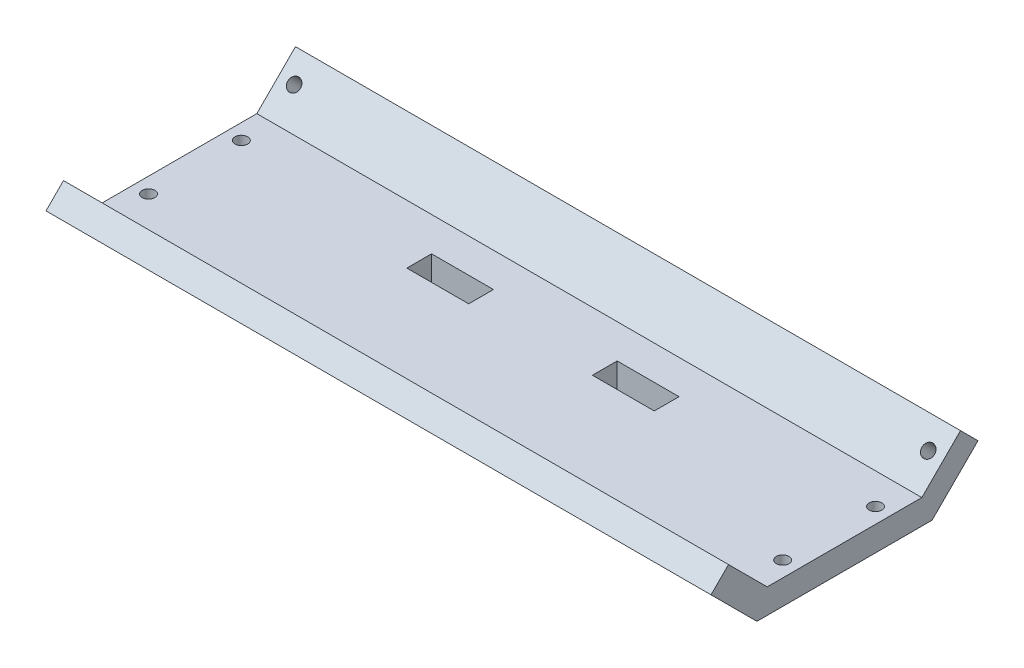
ISO-10303-21;
HEADER;
FILE_DESCRIPTION(('STEP AP214'),'2;1');
FILE_NAME('part.step','',(''),(''),'','','');
FILE_SCHEMA(('AUTOMOTIVE_DESIGN { 1 0 10303 214 1 1 1 1 }'));
ENDSEC;
DATA;
#1=APPLICATION_CONTEXT('core data for automotive mechanical design processes');
#2=APPLICATION_PROTOCOL_DEFINITION('international standard','automotive_design',2000,#1);
#3=PRODUCT_CONTEXT('',#1,'mechanical');
#4=PRODUCT('Part','Part','',(#3));
#5=PRODUCT_RELATED_PRODUCT_CATEGORY('part','',(#4));
#6=PRODUCT_DEFINITION_FORMATION('','',#4);
#7=PRODUCT_DEFINITION_CONTEXT('part definition',#1,'design');
#8=PRODUCT_DEFINITION('design','',#6,#7);
#9=PRODUCT_DEFINITION_SHAPE('','',#8);
#10=(LENGTH_UNIT() NAMED_UNIT(*) SI_UNIT(.MILLI.,.METRE.));
#11=(NAMED_UNIT(*) PLANE_ANGLE_UNIT() SI_UNIT($,.RADIAN.));
#12=(NAMED_UNIT(*) SI_UNIT($,.STERADIAN.) SOLID_ANGLE_UNIT());
#13=UNCERTAINTY_MEASURE_WITH_UNIT(LENGTH_MEASURE(1.E-05),#10,'distance_accuracy_value','');
#14=(GEOMETRIC_REPRESENTATION_CONTEXT(3) GLOBAL_UNCERTAINTY_ASSIGNED_CONTEXT((#13)) GLOBAL_UNIT_ASSIGNED_CONTEXT((#10,
#11,#12)) REPRESENTATION_CONTEXT('',''));
#15=CARTESIAN_POINT('',(0.,0.,0.));
#16=DIRECTION('',(0.,0.,1.));
#17=DIRECTION('',(1.,0.,0.));
#18=AXIS2_PLACEMENT_3D('',#15,#16,#17);
#19=CARTESIAN_POINT('',(107.5,12.4999999999999,37.5000000000001));
#20=DIRECTION('',(0.,-0.707106781186547,-0.707106781186548));
#21=DIRECTION('',(0.,0.707106781186548,-0.707106781186547));
#22=AXIS2_PLACEMENT_3D('',#19,#20,#21);
#23=PLANE('',#22);
#24=DIRECTION('',(0.,-0.707106781186548,0.707106781186547));
#25=VECTOR('',#24,1.);
#26=CARTESIAN_POINT('',(-107.5,12.4999999999999,37.5000000000001));
#27=LINE('',#26,#25);
#28=CARTESIAN_POINT('',(-107.5,12.4999999999999,37.5000000000001));
#29=VERTEX_POINT('',#28);
#30=CARTESIAN_POINT('',(-107.5,6.84314575050755,43.1568542494924));
#31=VERTEX_POINT('',#30);
#32=EDGE_CURVE('E268',#29,#31,#27,.T.);
#33=ORIENTED_EDGE('',*,*,#32,.T.);
#34=DIRECTION('',(-1.,0.,0.));
#35=VECTOR('',#34,1.);
#36=CARTESIAN_POINT('',(107.5,6.84314575050755,43.1568542494924));
#37=LINE('',#36,#35);
#38=CARTESIAN_POINT('',(107.5,6.84314575050755,43.1568542494924));
#39=VERTEX_POINT('',#38);
#40=EDGE_CURVE('E11',#39,#31,#37,.T.);
#41=ORIENTED_EDGE('',*,*,#40,.F.);
#42=DIRECTION('',(0.,-0.707106781186548,0.707106781186547));
#43=VECTOR('',#42,1.);
#44=CARTESIAN_POINT('',(107.5,12.4999999999999,37.5000000000001));
#45=LINE('',#44,#43);
#46=CARTESIAN_POINT('',(107.5,12.4999999999999,37.5000000000001));
#47=VERTEX_POINT('',#46);
#48=EDGE_CURVE('E269',#47,#39,#45,.T.);
#49=ORIENTED_EDGE('',*,*,#48,.F.);
#50=DIRECTION('',(-1.,0.,0.));
#51=VECTOR('',#50,1.);
#52=CARTESIAN_POINT('',(107.5,12.4999999999999,37.5000000000001));
#53=LINE('',#52,#51);
#54=EDGE_CURVE('E287',#47,#29,#53,.T.);
#55=ORIENTED_EDGE('',*,*,#54,.T.);
#56=EDGE_LOOP('',(#33,#41,#49,#55));
#57=FACE_BOUND('',#56,.T.);
#58=ADVANCED_FACE('F38',(#57),#23,.F.);
#59=CARTESIAN_POINT('',(107.5,-8.,28.313708498985));
#60=DIRECTION('',(0.,0.707106781186544,-0.707106781186551));
#61=DIRECTION('',(0.,0.707106781186551,0.707106781186544));
#62=AXIS2_PLACEMENT_3D('',#59,#60,#61);
#63=PLANE('',#62);
#64=CARTESIAN_POINT('',(-102.5,1.414213562373,37.7279220613579));
#65=DIRECTION('',(0.,0.707106781186544,-0.707106781186551));
#66=DIRECTION('',(0.,0.707106781186551,0.707106781186544));
#67=AXIS2_PLACEMENT_3D('',#64,#65,#66);
#68=CIRCLE('',#67,2.04999999999999);
#69=CARTESIAN_POINT('',(-102.5,2.86378246380542,39.1774909627903));
#70=VERTEX_POINT('',#69);
#71=EDGE_CURVE('E241',#70,#70,#68,.T.);
#72=ORIENTED_EDGE('',*,*,#71,.T.);
#73=EDGE_LOOP('',(#72));
#74=FACE_BOUND('',#73,.T.);
#75=CARTESIAN_POINT('',(102.5,1.414213562373,37.7279220613579));
#76=DIRECTION('',(0.,0.707106781186544,-0.707106781186551));
#77=DIRECTION('',(0.,0.707106781186551,0.707106781186544));
#78=AXIS2_PLACEMENT_3D('',#75,#76,#77);
#79=CIRCLE('',#78,2.04999999999999);
#80=CARTESIAN_POINT('',(102.5,2.86378246380542,39.1774909627903));
#81=VERTEX_POINT('',#80);
#82=EDGE_CURVE('E247',#81,#81,#79,.T.);
#83=ORIENTED_EDGE('',*,*,#82,.T.);
#84=EDGE_LOOP('',(#83));
#85=FACE_BOUND('',#84,.T.);
#86=DIRECTION('',(0.,-0.707106781186551,-0.707106781186544));
#87=VECTOR('',#86,1.);
#88=CARTESIAN_POINT('',(-107.5,-8.,28.313708498985));
#89=LINE('',#88,#87);
#90=CARTESIAN_POINT('',(-107.5,-8.,28.313708498985));
#91=VERTEX_POINT('',#90);
#92=EDGE_CURVE('E290',#31,#91,#89,.T.);
#93=ORIENTED_EDGE('',*,*,#92,.T.);
#94=DIRECTION('',(-1.,0.,0.));
#95=VECTOR('',#94,1.);
#96=CARTESIAN_POINT('',(107.5,-8.,28.313708498985));
#97=LINE('',#96,#95);
#98=CARTESIAN_POINT('',(107.5,-8.,28.313708498985));
#99=VERTEX_POINT('',#98);
#100=EDGE_CURVE('E45',#99,#91,#97,.T.);
#101=ORIENTED_EDGE('',*,*,#100,.F.);
#102=DIRECTION('',(0.,-0.707106781186551,-0.707106781186544));
#103=VECTOR('',#102,1.);
#104=CARTESIAN_POINT('',(107.5,-8.,28.313708498985));
#105=LINE('',#104,#103);
#106=EDGE_CURVE('E272',#39,#99,#105,.T.);
#107=ORIENTED_EDGE('',*,*,#106,.F.);
#108=ORIENTED_EDGE('',*,*,#40,.T.);
#109=EDGE_LOOP('',(#93,#101,#107,#108));
#110=FACE_BOUND('',#109,.T.);
#111=ADVANCED_FACE('F346',(#74,#85,#110),#63,.F.);
#112=CARTESIAN_POINT('',(107.5,-8.,28.313708498985));
#113=DIRECTION('',(0.,1.,0.));
#114=DIRECTION('',(0.,0.,1.));
#115=AXIS2_PLACEMENT_3D('',#112,#113,#114);
#116=PLANE('',#115);
#117=DIRECTION('',(1.,0.,0.));
#118=VECTOR('',#117,1.);
#119=CARTESIAN_POINT('',(20.,-8.,-6.));
#120=LINE('',#119,#118);
#121=CARTESIAN_POINT('',(20.,-8.,-6.));
#122=VERTEX_POINT('',#121);
#123=CARTESIAN_POINT('',(40.,-8.,-6.));
#124=VERTEX_POINT('',#123);
#125=EDGE_CURVE('E162',#122,#124,#120,.T.);
#126=ORIENTED_EDGE('',*,*,#125,.T.);
#127=DIRECTION('',(0.,0.,-1.));
#128=VECTOR('',#127,1.);
#129=CARTESIAN_POINT('',(40.,-8.,-14.));
#130=LINE('',#129,#128);
#131=CARTESIAN_POINT('',(40.,-8.,-14.));
#132=VERTEX_POINT('',#131);
#133=EDGE_CURVE('E154',#124,#132,#130,.T.);
#134=ORIENTED_EDGE('',*,*,#133,.T.);
#135=DIRECTION('',(-1.,0.,0.));
#136=VECTOR('',#135,1.);
#137=CARTESIAN_POINT('',(20.,-8.,-14.));
#138=LINE('',#137,#136);
#139=CARTESIAN_POINT('',(20.,-8.,-14.));
#140=VERTEX_POINT('',#139);
#141=EDGE_CURVE('E165',#132,#140,#138,.T.);
#142=ORIENTED_EDGE('',*,*,#141,.T.);
#143=DIRECTION('',(0.,0.,1.));
#144=VECTOR('',#143,1.);
#145=CARTESIAN_POINT('',(20.,-8.,-14.));
#146=LINE('',#145,#144);
#147=EDGE_CURVE('E52',#140,#122,#146,.T.);
#148=ORIENTED_EDGE('',*,*,#147,.T.);
#149=EDGE_LOOP('',(#126,#134,#142,#148));
#150=FACE_BOUND('',#149,.T.);
#151=DIRECTION('',(1.,0.,0.));
#152=VECTOR('',#151,1.);
#153=CARTESIAN_POINT('',(-40.,-8.,-6.));
#154=LINE('',#153,#152);
#155=CARTESIAN_POINT('',(-40.,-8.,-6.));
#156=VERTEX_POINT('',#155);
#157=CARTESIAN_POINT('',(-20.,-8.,-6.));
#158=VERTEX_POINT('',#157);
#159=EDGE_CURVE('E195',#156,#158,#154,.T.);
#160=ORIENTED_EDGE('',*,*,#159,.T.);
#161=DIRECTION('',(0.,0.,-1.));
#162=VECTOR('',#161,1.);
#163=CARTESIAN_POINT('',(-20.,-8.,-14.));
#164=LINE('',#163,#162);
#165=CARTESIAN_POINT('',(-20.,-8.,-14.));
#166=VERTEX_POINT('',#165);
#167=EDGE_CURVE('E206',#158,#166,#164,.T.);
#168=ORIENTED_EDGE('',*,*,#167,.T.);
#169=DIRECTION('',(-1.,0.,0.));
#170=VECTOR('',#169,1.);
#171=CARTESIAN_POINT('',(-40.,-8.,-14.));
#172=LINE('',#171,#170);
#173=CARTESIAN_POINT('',(-40.,-8.,-14.));
#174=VERTEX_POINT('',#173);
#175=EDGE_CURVE('E216',#166,#174,#172,.T.);
#176=ORIENTED_EDGE('',*,*,#175,.T.);
#177=DIRECTION('',(0.,0.,1.));
#178=VECTOR('',#177,1.);
#179=CARTESIAN_POINT('',(-40.,-8.,-14.));
#180=LINE('',#179,#178);
#181=EDGE_CURVE('E60',#174,#156,#180,.T.);
#182=ORIENTED_EDGE('',*,*,#181,.T.);
#183=EDGE_LOOP('',(#160,#168,#176,#182));
#184=FACE_BOUND('',#183,.T.);
#185=CARTESIAN_POINT('',(-102.5,-8.,-15.0000000000001));
#186=DIRECTION('',(0.,1.,0.));
#187=DIRECTION('',(0.,0.,1.));
#188=AXIS2_PLACEMENT_3D('',#185,#186,#187);
#189=CIRCLE('',#188,2.05);
#190=CARTESIAN_POINT('',(-102.5,-8.,-12.9500000000001));
#191=VERTEX_POINT('',#190);
#192=EDGE_CURVE('E229',#191,#191,#189,.T.);
#193=ORIENTED_EDGE('',*,*,#192,.T.);
#194=EDGE_LOOP('',(#193));
#195=FACE_BOUND('',#194,.T.);
#196=CARTESIAN_POINT('',(-102.5,-8.,15.0000000000001));
#197=DIRECTION('',(0.,1.,0.));
#198=DIRECTION('',(0.,0.,1.));
#199=AXIS2_PLACEMENT_3D('',#196,#197,#198);
#200=CIRCLE('',#199,2.05);
#201=CARTESIAN_POINT('',(-102.5,-8.,17.0500000000001));
#202=VERTEX_POINT('',#201);
#203=EDGE_CURVE('E235',#202,#202,#200,.T.);
#204=ORIENTED_EDGE('',*,*,#203,.T.);
#205=EDGE_LOOP('',(#204));
#206=FACE_BOUND('',#205,.T.);
#207=CARTESIAN_POINT('',(102.5,-8.,15.0000000000001));
#208=DIRECTION('',(0.,1.,0.));
#209=DIRECTION('',(0.,0.,1.));
#210=AXIS2_PLACEMENT_3D('',#207,#208,#209);
#211=CIRCLE('',#210,2.05);
#212=CARTESIAN_POINT('',(102.5,-8.,17.0500000000001));
#213=VERTEX_POINT('',#212);
#214=EDGE_CURVE('E253',#213,#213,#211,.T.);
#215=ORIENTED_EDGE('',*,*,#214,.T.);
#216=EDGE_LOOP('',(#215));
#217=FACE_BOUND('',#216,.T.);
#218=CARTESIAN_POINT('',(102.5,-8.,-15.0000000000001));
#219=DIRECTION('',(0.,1.,0.));
#220=DIRECTION('',(0.,0.,1.));
#221=AXIS2_PLACEMENT_3D('',#218,#219,#220);
#222=CIRCLE('',#221,2.05);
#223=CARTESIAN_POINT('',(102.5,-8.,-12.9500000000001));
#224=VERTEX_POINT('',#223);
#225=EDGE_CURVE('E259',#224,#224,#222,.T.);
#226=ORIENTED_EDGE('',*,*,#225,.T.);
#227=EDGE_LOOP('',(#226));
#228=FACE_BOUND('',#227,.T.);
#229=DIRECTION('',(0.,0.,-1.));
#230=VECTOR('',#229,1.);
#231=CARTESIAN_POINT('',(-107.5,-8.,28.313708498985));
#232=LINE('',#231,#230);
#233=CARTESIAN_POINT('',(-107.5,-8.,-28.3137084989848));
#234=VERTEX_POINT('',#233);
#235=EDGE_CURVE('E292',#91,#234,#232,.T.);
#236=ORIENTED_EDGE('',*,*,#235,.T.);
#237=DIRECTION('',(-1.,0.,0.));
#238=VECTOR('',#237,1.);
#239=CARTESIAN_POINT('',(107.5,-8.,-28.3137084989848));
#240=LINE('',#239,#238);
#241=CARTESIAN_POINT('',(107.5,-8.,-28.3137084989848));
#242=VERTEX_POINT('',#241);
#243=EDGE_CURVE('E317',#242,#234,#240,.T.);
#244=ORIENTED_EDGE('',*,*,#243,.F.);
#245=DIRECTION('',(0.,0.,-1.));
#246=VECTOR('',#245,1.);
#247=CARTESIAN_POINT('',(107.5,-8.,28.313708498985));
#248=LINE('',#247,#246);
#249=EDGE_CURVE('E275',#99,#242,#248,.T.);
#250=ORIENTED_EDGE('',*,*,#249,.F.);
#251=ORIENTED_EDGE('',*,*,#100,.T.);
#252=EDGE_LOOP('',(#236,#244,#250,#251));
#253=FACE_BOUND('',#252,.T.);
#254=ADVANCED_FACE('F169',(#150,#184,#195,#206,#217,#228,#253),#116,.F.);
#255=CARTESIAN_POINT('',(107.5,-8.,-28.3137084989848));
#256=DIRECTION('',(0.,0.707106781186547,0.707106781186547));
#257=DIRECTION('',(0.,-0.707106781186548,0.707106781186548));
#258=AXIS2_PLACEMENT_3D('',#255,#256,#257);
#259=PLANE('',#258);
#260=CARTESIAN_POINT('',(-102.5,1.41421356237308,-37.7279220613579));
#261=DIRECTION('',(0.,0.707106781186547,0.707106781186547));
#262=DIRECTION('',(0.,-0.707106781186548,0.707106781186548));
#263=AXIS2_PLACEMENT_3D('',#260,#261,#262);
#264=CIRCLE('',#263,2.04999999999999);
#265=CARTESIAN_POINT('',(-102.5,-0.0353553390593389,-36.2783531599255));
#266=VERTEX_POINT('',#265);
#267=EDGE_CURVE('E223',#266,#266,#264,.T.);
#268=ORIENTED_EDGE('',*,*,#267,.T.);
#269=EDGE_LOOP('',(#268));
#270=FACE_BOUND('',#269,.T.);
#271=CARTESIAN_POINT('',(102.5,1.41421356237306,-37.7279220613579));
#272=DIRECTION('',(0.,0.707106781186547,0.707106781186547));
#273=DIRECTION('',(0.,-0.707106781186548,0.707106781186548));
#274=AXIS2_PLACEMENT_3D('',#271,#272,#273);
#275=CIRCLE('',#274,2.04999999999999);
#276=CARTESIAN_POINT('',(102.5,-0.0353553390593537,-36.2783531599255));
#277=VERTEX_POINT('',#276);
#278=EDGE_CURVE('E265',#277,#277,#275,.T.);
#279=ORIENTED_EDGE('',*,*,#278,.T.);
#280=EDGE_LOOP('',(#279));
#281=FACE_BOUND('',#280,.T.);
#282=DIRECTION('',(0.,0.707106781186548,-0.707106781186548));
#283=VECTOR('',#282,1.);
#284=CARTESIAN_POINT('',(-107.5,-8.,-28.3137084989848));
#285=LINE('',#284,#283);
#286=CARTESIAN_POINT('',(-107.5,6.84314575050755,-43.1568542494924));
#287=VERTEX_POINT('',#286);
#288=EDGE_CURVE('E294',#234,#287,#285,.T.);
#289=ORIENTED_EDGE('',*,*,#288,.T.);
#290=DIRECTION('',(-1.,0.,0.));
#291=VECTOR('',#290,1.);
#292=CARTESIAN_POINT('',(107.5,6.84314575050755,-43.1568542494924));
#293=LINE('',#292,#291);
#294=CARTESIAN_POINT('',(107.5,6.84314575050755,-43.1568542494924));
#295=VERTEX_POINT('',#294);
#296=EDGE_CURVE('E314',#295,#287,#293,.T.);
#297=ORIENTED_EDGE('',*,*,#296,.F.);
#298=DIRECTION('',(0.,0.707106781186548,-0.707106781186548));
#299=VECTOR('',#298,1.);
#300=CARTESIAN_POINT('',(107.5,-8.,-28.3137084989848));
#301=LINE('',#300,#299);
#302=EDGE_CURVE('E277',#242,#295,#301,.T.);
#303=ORIENTED_EDGE('',*,*,#302,.F.);
#304=ORIENTED_EDGE('',*,*,#243,.T.);
#305=EDGE_LOOP('',(#289,#297,#303,#304));
#306=FACE_BOUND('',#305,.T.);
#307=ADVANCED_FACE('F334',(#270,#281,#306),#259,.F.);
#308=CARTESIAN_POINT('',(107.5,12.5,-37.5));
#309=DIRECTION('',(0.,-0.707106781186547,0.707106781186548));
#310=DIRECTION('',(0.,-0.707106781186548,-0.707106781186547));
#311=AXIS2_PLACEMENT_3D('',#308,#309,#310);
#312=PLANE('',#311);
#313=DIRECTION('',(0.,0.707106781186548,0.707106781186547));
#314=VECTOR('',#313,1.);
#315=CARTESIAN_POINT('',(-107.5,12.5,-37.5));
#316=LINE('',#315,#314);
#317=CARTESIAN_POINT('',(-107.5,12.5,-37.5));
#318=VERTEX_POINT('',#317);
#319=EDGE_CURVE('E296',#287,#318,#316,.T.);
#320=ORIENTED_EDGE('',*,*,#319,.T.);
#321=DIRECTION('',(-1.,0.,0.));
#322=VECTOR('',#321,1.);
#323=CARTESIAN_POINT('',(107.5,12.5,-37.5));
#324=LINE('',#323,#322);
#325=CARTESIAN_POINT('',(107.5,12.5,-37.5));
#326=VERTEX_POINT('',#325);
#327=EDGE_CURVE('E311',#326,#318,#324,.T.);
#328=ORIENTED_EDGE('',*,*,#327,.F.);
#329=DIRECTION('',(0.,0.707106781186548,0.707106781186547));
#330=VECTOR('',#329,1.);
#331=CARTESIAN_POINT('',(107.5,12.5,-37.5));
#332=LINE('',#331,#330);
#333=EDGE_CURVE('E279',#295,#326,#332,.T.);
#334=ORIENTED_EDGE('',*,*,#333,.F.);
#335=ORIENTED_EDGE('',*,*,#296,.T.);
#336=EDGE_LOOP('',(#320,#328,#334,#335));
#337=FACE_BOUND('',#336,.T.);
#338=ADVANCED_FACE('F338',(#337),#312,.F.);
#339=CARTESIAN_POINT('',(107.5,0.,-25.0000000000001));
#340=DIRECTION('',(0.,-0.707106781186546,-0.707106781186549));
#341=DIRECTION('',(0.,0.707106781186549,-0.707106781186546));
#342=AXIS2_PLACEMENT_3D('',#339,#340,#341);
#343=PLANE('',#342);
#344=CARTESIAN_POINT('',(-102.5,7.07106781186545,-32.0710678118655));
#345=DIRECTION('',(0.,0.707106781186546,0.707106781186549));
#346=DIRECTION('',(0.,-0.707106781186549,0.707106781186546));
#347=AXIS2_PLACEMENT_3D('',#344,#345,#346);
#348=CIRCLE('',#347,2.04999999999998);
#349=CARTESIAN_POINT('',(-102.5,5.62149891043304,-30.6214989104331));
#350=VERTEX_POINT('',#349);
#351=EDGE_CURVE('E188',#350,#350,#348,.T.);
#352=ORIENTED_EDGE('',*,*,#351,.F.);
#353=EDGE_LOOP('',(#352));
#354=FACE_BOUND('',#353,.T.);
#355=CARTESIAN_POINT('',(102.5,7.07106781186544,-32.0710678118655));
#356=DIRECTION('',(0.,0.707106781186546,0.707106781186549));
#357=DIRECTION('',(0.,-0.707106781186549,0.707106781186546));
#358=AXIS2_PLACEMENT_3D('',#355,#356,#357);
#359=CIRCLE('',#358,2.04999999999998);
#360=CARTESIAN_POINT('',(102.5,5.62149891043302,-30.6214989104331));
#361=VERTEX_POINT('',#360);
#362=EDGE_CURVE('E262',#361,#361,#359,.T.);
#363=ORIENTED_EDGE('',*,*,#362,.F.);
#364=EDGE_LOOP('',(#363));
#365=FACE_BOUND('',#364,.T.);
#366=DIRECTION('',(0.,-0.707106781186549,0.707106781186546));
#367=VECTOR('',#366,1.);
#368=CARTESIAN_POINT('',(-107.5,0.,-25.0000000000001));
#369=LINE('',#368,#367);
#370=CARTESIAN_POINT('',(-107.5,0.,-25.0000000000001));
#371=VERTEX_POINT('',#370);
#372=EDGE_CURVE('E298',#318,#371,#369,.T.);
#373=ORIENTED_EDGE('',*,*,#372,.T.);
#374=DIRECTION('',(-1.,0.,0.));
#375=VECTOR('',#374,1.);
#376=CARTESIAN_POINT('',(107.5,0.,-25.0000000000001));
#377=LINE('',#376,#375);
#378=CARTESIAN_POINT('',(107.5,0.,-25.0000000000001));
#379=VERTEX_POINT('',#378);
#380=EDGE_CURVE('E308',#379,#371,#377,.T.);
#381=ORIENTED_EDGE('',*,*,#380,.F.);
#382=DIRECTION('',(0.,-0.707106781186549,0.707106781186546));
#383=VECTOR('',#382,1.);
#384=CARTESIAN_POINT('',(107.5,0.,-25.0000000000001));
#385=LINE('',#384,#383);
#386=EDGE_CURVE('E281',#326,#379,#385,.T.);
#387=ORIENTED_EDGE('',*,*,#386,.F.);
#388=ORIENTED_EDGE('',*,*,#327,.T.);
#389=EDGE_LOOP('',(#373,#381,#387,#388));
#390=FACE_BOUND('',#389,.T.);
#391=ADVANCED_FACE('F359',(#354,#365,#390),#343,.F.);
#392=CARTESIAN_POINT('',(107.5,0.,25.0000000000001));
#393=DIRECTION('',(0.,-1.,0.));
#394=DIRECTION('',(0.,0.,-1.));
#395=AXIS2_PLACEMENT_3D('',#392,#393,#394);
#396=PLANE('',#395);
#397=DIRECTION('',(-1.,0.,0.));
#398=VECTOR('',#397,1.);
#399=CARTESIAN_POINT('',(20.,0.,-14.));
#400=LINE('',#399,#398);
#401=CARTESIAN_POINT('',(40.,0.,-14.));
#402=VERTEX_POINT('',#401);
#403=CARTESIAN_POINT('',(20.,0.,-14.));
#404=VERTEX_POINT('',#403);
#405=EDGE_CURVE('E181',#402,#404,#400,.T.);
#406=ORIENTED_EDGE('',*,*,#405,.F.);
#407=DIRECTION('',(0.,0.,-1.));
#408=VECTOR('',#407,1.);
#409=CARTESIAN_POINT('',(40.,0.,-14.));
#410=LINE('',#409,#408);
#411=CARTESIAN_POINT('',(40.,0.,-6.));
#412=VERTEX_POINT('',#411);
#413=EDGE_CURVE('E157',#412,#402,#410,.T.);
#414=ORIENTED_EDGE('',*,*,#413,.F.);
#415=DIRECTION('',(1.,0.,0.));
#416=VECTOR('',#415,1.);
#417=CARTESIAN_POINT('',(20.,0.,-6.));
#418=LINE('',#417,#416);
#419=CARTESIAN_POINT('',(20.,0.,-6.));
#420=VERTEX_POINT('',#419);
#421=EDGE_CURVE('E172',#420,#412,#418,.T.);
#422=ORIENTED_EDGE('',*,*,#421,.F.);
#423=DIRECTION('',(0.,0.,1.));
#424=VECTOR('',#423,1.);
#425=CARTESIAN_POINT('',(20.,0.,-14.));
#426=LINE('',#425,#424);
#427=EDGE_CURVE('E175',#404,#420,#426,.T.);
#428=ORIENTED_EDGE('',*,*,#427,.F.);
#429=EDGE_LOOP('',(#406,#414,#422,#428));
#430=FACE_BOUND('',#429,.T.);
#431=DIRECTION('',(-1.,0.,0.));
#432=VECTOR('',#431,1.);
#433=CARTESIAN_POINT('',(-40.,0.,-14.));
#434=LINE('',#433,#432);
#435=CARTESIAN_POINT('',(-20.,0.,-14.));
#436=VERTEX_POINT('',#435);
#437=CARTESIAN_POINT('',(-40.,0.,-14.));
#438=VERTEX_POINT('',#437);
#439=EDGE_CURVE('E209',#436,#438,#434,.T.);
#440=ORIENTED_EDGE('',*,*,#439,.F.);
#441=DIRECTION('',(0.,0.,-1.));
#442=VECTOR('',#441,1.);
#443=CARTESIAN_POINT('',(-20.,0.,-14.));
#444=LINE('',#443,#442);
#445=CARTESIAN_POINT('',(-20.,0.,-6.));
#446=VERTEX_POINT('',#445);
#447=EDGE_CURVE('E182',#446,#436,#444,.T.);
#448=ORIENTED_EDGE('',*,*,#447,.F.);
#449=DIRECTION('',(1.,0.,0.));
#450=VECTOR('',#449,1.);
#451=CARTESIAN_POINT('',(-40.,0.,-6.));
#452=LINE('',#451,#450);
#453=CARTESIAN_POINT('',(-40.,0.,-6.));
#454=VERTEX_POINT('',#453);
#455=EDGE_CURVE('E202',#454,#446,#452,.T.);
#456=ORIENTED_EDGE('',*,*,#455,.F.);
#457=DIRECTION('',(0.,0.,1.));
#458=VECTOR('',#457,1.);
#459=CARTESIAN_POINT('',(-40.,0.,-14.));
#460=LINE('',#459,#458);
#461=EDGE_CURVE('E205',#438,#454,#460,.T.);
#462=ORIENTED_EDGE('',*,*,#461,.F.);
#463=EDGE_LOOP('',(#440,#448,#456,#462));
#464=FACE_BOUND('',#463,.T.);
#465=CARTESIAN_POINT('',(-102.5,0.,-15.0000000000001));
#466=DIRECTION('',(0.,1.,0.));
#467=DIRECTION('',(0.,0.,1.));
#468=AXIS2_PLACEMENT_3D('',#465,#466,#467);
#469=CIRCLE('',#468,2.04999999999998);
#470=CARTESIAN_POINT('',(-102.5,0.,-12.9500000000001));
#471=VERTEX_POINT('',#470);
#472=EDGE_CURVE('E226',#471,#471,#469,.T.);
#473=ORIENTED_EDGE('',*,*,#472,.F.);
#474=EDGE_LOOP('',(#473));
#475=FACE_BOUND('',#474,.T.);
#476=CARTESIAN_POINT('',(-102.5,0.,15.0000000000001));
#477=DIRECTION('',(0.,1.,0.));
#478=DIRECTION('',(0.,0.,1.));
#479=AXIS2_PLACEMENT_3D('',#476,#477,#478);
#480=CIRCLE('',#479,2.04999999999998);
#481=CARTESIAN_POINT('',(-102.5,0.,17.0500000000001));
#482=VERTEX_POINT('',#481);
#483=EDGE_CURVE('E232',#482,#482,#480,.T.);
#484=ORIENTED_EDGE('',*,*,#483,.F.);
#485=EDGE_LOOP('',(#484));
#486=FACE_BOUND('',#485,.T.);
#487=CARTESIAN_POINT('',(102.5,0.,15.0000000000001));
#488=DIRECTION('',(0.,1.,0.));
#489=DIRECTION('',(0.,0.,1.));
#490=AXIS2_PLACEMENT_3D('',#487,#488,#489);
#491=CIRCLE('',#490,2.04999999999998);
#492=CARTESIAN_POINT('',(102.5,0.,17.0500000000001));
#493=VERTEX_POINT('',#492);
#494=EDGE_CURVE('E250',#493,#493,#491,.T.);
#495=ORIENTED_EDGE('',*,*,#494,.F.);
#496=EDGE_LOOP('',(#495));
#497=FACE_BOUND('',#496,.T.);
#498=CARTESIAN_POINT('',(102.5,0.,-15.0000000000001));
#499=DIRECTION('',(0.,1.,0.));
#500=DIRECTION('',(0.,0.,1.));
#501=AXIS2_PLACEMENT_3D('',#498,#499,#500);
#502=CIRCLE('',#501,2.04999999999998);
#503=CARTESIAN_POINT('',(102.5,0.,-12.9500000000001));
#504=VERTEX_POINT('',#503);
#505=EDGE_CURVE('E256',#504,#504,#502,.T.);
#506=ORIENTED_EDGE('',*,*,#505,.F.);
#507=EDGE_LOOP('',(#506));
#508=FACE_BOUND('',#507,.T.);
#509=DIRECTION('',(0.,0.,1.));
#510=VECTOR('',#509,1.);
#511=CARTESIAN_POINT('',(-107.5,0.,25.0000000000001));
#512=LINE('',#511,#510);
#513=CARTESIAN_POINT('',(-107.5,0.,25.0000000000001));
#514=VERTEX_POINT('',#513);
#515=EDGE_CURVE('E300',#371,#514,#512,.T.);
#516=ORIENTED_EDGE('',*,*,#515,.T.);
#517=DIRECTION('',(-1.,0.,0.));
#518=VECTOR('',#517,1.);
#519=CARTESIAN_POINT('',(107.5,0.,25.0000000000001));
#520=LINE('',#519,#518);
#521=CARTESIAN_POINT('',(107.5,0.,25.0000000000001));
#522=VERTEX_POINT('',#521);
#523=EDGE_CURVE('E305',#522,#514,#520,.T.);
#524=ORIENTED_EDGE('',*,*,#523,.F.);
#525=DIRECTION('',(0.,0.,1.));
#526=VECTOR('',#525,1.);
#527=CARTESIAN_POINT('',(107.5,0.,25.0000000000001));
#528=LINE('',#527,#526);
#529=EDGE_CURVE('E283',#379,#522,#528,.T.);
#530=ORIENTED_EDGE('',*,*,#529,.F.);
#531=ORIENTED_EDGE('',*,*,#380,.T.);
#532=EDGE_LOOP('',(#516,#524,#530,#531));
#533=FACE_BOUND('',#532,.T.);
#534=ADVANCED_FACE('F357',(#430,#464,#475,#486,#497,#508,#533),#396,.F.);
#535=CARTESIAN_POINT('',(107.5,0.,25.0000000000001));
#536=DIRECTION('',(0.,-0.707106781186551,0.707106781186544));
#537=DIRECTION('',(0.,-0.707106781186544,-0.707106781186551));
#538=AXIS2_PLACEMENT_3D('',#535,#536,#537);
#539=PLANE('',#538);
#540=CARTESIAN_POINT('',(-102.5,7.0710678118654,32.0710678118656));
#541=DIRECTION('',(0.,0.707106781186551,-0.707106781186544));
#542=DIRECTION('',(0.,0.707106781186544,0.707106781186551));
#543=AXIS2_PLACEMENT_3D('',#540,#541,#542);
#544=CIRCLE('',#543,2.04999999999998);
#545=CARTESIAN_POINT('',(-102.5,8.5206367132978,33.520636713298));
#546=VERTEX_POINT('',#545);
#547=EDGE_CURVE('E238',#546,#546,#544,.T.);
#548=ORIENTED_EDGE('',*,*,#547,.F.);
#549=EDGE_LOOP('',(#548));
#550=FACE_BOUND('',#549,.T.);
#551=CARTESIAN_POINT('',(102.5,7.0710678118654,32.0710678118656));
#552=DIRECTION('',(0.,0.707106781186551,-0.707106781186544));
#553=DIRECTION('',(0.,0.707106781186544,0.707106781186551));
#554=AXIS2_PLACEMENT_3D('',#551,#552,#553);
#555=CIRCLE('',#554,2.04999999999998);
#556=CARTESIAN_POINT('',(102.5,8.5206367132978,33.520636713298));
#557=VERTEX_POINT('',#556);
#558=EDGE_CURVE('E244',#557,#557,#555,.T.);
#559=ORIENTED_EDGE('',*,*,#558,.F.);
#560=EDGE_LOOP('',(#559));
#561=FACE_BOUND('',#560,.T.);
#562=DIRECTION('',(0.,0.707106781186544,0.707106781186551));
#563=VECTOR('',#562,1.);
#564=CARTESIAN_POINT('',(-107.5,0.,25.0000000000001));
#565=LINE('',#564,#563);
#566=EDGE_CURVE('E273',#514,#29,#565,.T.);
#567=ORIENTED_EDGE('',*,*,#566,.T.);
#568=ORIENTED_EDGE('',*,*,#54,.F.);
#569=DIRECTION('',(0.,0.707106781186544,0.707106781186551));
#570=VECTOR('',#569,1.);
#571=CARTESIAN_POINT('',(107.5,0.,25.0000000000001));
#572=LINE('',#571,#570);
#573=EDGE_CURVE('E285',#522,#47,#572,.T.);
#574=ORIENTED_EDGE('',*,*,#573,.F.);
#575=ORIENTED_EDGE('',*,*,#523,.T.);
#576=EDGE_LOOP('',(#567,#568,#574,#575));
#577=FACE_BOUND('',#576,.T.);
#578=ADVANCED_FACE('F352',(#550,#561,#577),#539,.F.);
#579=CARTESIAN_POINT('',(107.5,0.,0.));
#580=DIRECTION('',(-1.,0.,0.));
#581=DIRECTION('',(0.,0.,1.));
#582=AXIS2_PLACEMENT_3D('',#579,#580,#581);
#583=PLANE('',#582);
#584=ORIENTED_EDGE('',*,*,#48,.T.);
#585=ORIENTED_EDGE('',*,*,#106,.T.);
#586=ORIENTED_EDGE('',*,*,#249,.T.);
#587=ORIENTED_EDGE('',*,*,#302,.T.);
#588=ORIENTED_EDGE('',*,*,#333,.T.);
#589=ORIENTED_EDGE('',*,*,#386,.T.);
#590=ORIENTED_EDGE('',*,*,#529,.T.);
#591=ORIENTED_EDGE('',*,*,#573,.T.);
#592=EDGE_LOOP('',(#584,#585,#586,#587,#588,#589,#590,#591));
#593=FACE_BOUND('',#592,.T.);
#594=ADVANCED_FACE('F342',(#593),#583,.F.);
#595=CARTESIAN_POINT('',(-107.5,0.,0.));
#596=DIRECTION('',(-1.,0.,0.));
#597=DIRECTION('',(0.,0.,1.));
#598=AXIS2_PLACEMENT_3D('',#595,#596,#597);
#599=PLANE('',#598);
#600=ORIENTED_EDGE('',*,*,#32,.F.);
#601=ORIENTED_EDGE('',*,*,#566,.F.);
#602=ORIENTED_EDGE('',*,*,#515,.F.);
#603=ORIENTED_EDGE('',*,*,#372,.F.);
#604=ORIENTED_EDGE('',*,*,#319,.F.);
#605=ORIENTED_EDGE('',*,*,#288,.F.);
#606=ORIENTED_EDGE('',*,*,#235,.F.);
#607=ORIENTED_EDGE('',*,*,#92,.F.);
#608=EDGE_LOOP('',(#600,#601,#602,#603,#604,#605,#606,#607));
#609=FACE_BOUND('',#608,.T.);
#610=ADVANCED_FACE('F329',(#609),#599,.T.);
#611=CARTESIAN_POINT('',(102.5,7.07106781186544,-32.0710678118655));
#612=DIRECTION('',(0.,0.707106781186546,0.707106781186549));
#613=DIRECTION('',(0.,-0.707106781186549,0.707106781186546));
#614=AXIS2_PLACEMENT_3D('',#611,#612,#613);
#615=CYLINDRICAL_SURFACE('',#614,2.04999999999999);
#616=ORIENTED_EDGE('',*,*,#362,.T.);
#617=EDGE_LOOP('',(#616));
#618=FACE_BOUND('',#617,.T.);
#619=ORIENTED_EDGE('',*,*,#278,.F.);
#620=EDGE_LOOP('',(#619));
#621=FACE_BOUND('',#620,.T.);
#622=ADVANCED_FACE('F393',(#618,#621),#615,.F.);
#623=CARTESIAN_POINT('',(102.5,0.,-15.0000000000001));
#624=DIRECTION('',(0.,1.,0.));
#625=DIRECTION('',(0.,0.,1.));
#626=AXIS2_PLACEMENT_3D('',#623,#624,#625);
#627=CYLINDRICAL_SURFACE('',#626,2.04999999999999);
#628=ORIENTED_EDGE('',*,*,#225,.F.);
#629=EDGE_LOOP('',(#628));
#630=FACE_BOUND('',#629,.T.);
#631=ORIENTED_EDGE('',*,*,#505,.T.);
#632=EDGE_LOOP('',(#631));
#633=FACE_BOUND('',#632,.T.);
#634=ADVANCED_FACE('F395',(#630,#633),#627,.F.);
#635=CARTESIAN_POINT('',(102.5,0.,15.0000000000001));
#636=DIRECTION('',(0.,1.,0.));
#637=DIRECTION('',(0.,0.,1.));
#638=AXIS2_PLACEMENT_3D('',#635,#636,#637);
#639=CYLINDRICAL_SURFACE('',#638,2.04999999999999);
#640=ORIENTED_EDGE('',*,*,#214,.F.);
#641=EDGE_LOOP('',(#640));
#642=FACE_BOUND('',#641,.T.);
#643=ORIENTED_EDGE('',*,*,#494,.T.);
#644=EDGE_LOOP('',(#643));
#645=FACE_BOUND('',#644,.T.);
#646=ADVANCED_FACE('F401',(#642,#645),#639,.F.);
#647=CARTESIAN_POINT('',(102.5,7.0710678118654,32.0710678118656));
#648=DIRECTION('',(0.,0.707106781186551,-0.707106781186544));
#649=DIRECTION('',(0.,0.707106781186544,0.707106781186551));
#650=AXIS2_PLACEMENT_3D('',#647,#648,#649);
#651=CYLINDRICAL_SURFACE('',#650,2.04999999999999);
#652=ORIENTED_EDGE('',*,*,#558,.T.);
#653=EDGE_LOOP('',(#652));
#654=FACE_BOUND('',#653,.T.);
#655=ORIENTED_EDGE('',*,*,#82,.F.);
#656=EDGE_LOOP('',(#655));
#657=FACE_BOUND('',#656,.T.);
#658=ADVANCED_FACE('F416',(#654,#657),#651,.F.);
#659=CARTESIAN_POINT('',(-102.5,7.0710678118654,32.0710678118656));
#660=DIRECTION('',(0.,0.707106781186551,-0.707106781186544));
#661=DIRECTION('',(0.,0.707106781186544,0.707106781186551));
#662=AXIS2_PLACEMENT_3D('',#659,#660,#661);
#663=CYLINDRICAL_SURFACE('',#662,2.04999999999999);
#664=ORIENTED_EDGE('',*,*,#547,.T.);
#665=EDGE_LOOP('',(#664));
#666=FACE_BOUND('',#665,.T.);
#667=ORIENTED_EDGE('',*,*,#71,.F.);
#668=EDGE_LOOP('',(#667));
#669=FACE_BOUND('',#668,.T.);
#670=ADVANCED_FACE('F419',(#666,#669),#663,.F.);
#671=CARTESIAN_POINT('',(-102.5,0.,15.0000000000001));
#672=DIRECTION('',(0.,1.,0.));
#673=DIRECTION('',(0.,0.,1.));
#674=AXIS2_PLACEMENT_3D('',#671,#672,#673);
#675=CYLINDRICAL_SURFACE('',#674,2.04999999999999);
#676=ORIENTED_EDGE('',*,*,#203,.F.);
#677=EDGE_LOOP('',(#676));
#678=FACE_BOUND('',#677,.T.);
#679=ORIENTED_EDGE('',*,*,#483,.T.);
#680=EDGE_LOOP('',(#679));
#681=FACE_BOUND('',#680,.T.);
#682=ADVANCED_FACE('F426',(#678,#681),#675,.F.);
#683=CARTESIAN_POINT('',(-102.5,0.,-15.0000000000001));
#684=DIRECTION('',(0.,1.,0.));
#685=DIRECTION('',(0.,0.,1.));
#686=AXIS2_PLACEMENT_3D('',#683,#684,#685);
#687=CYLINDRICAL_SURFACE('',#686,2.04999999999999);
#688=ORIENTED_EDGE('',*,*,#192,.F.);
#689=EDGE_LOOP('',(#688));
#690=FACE_BOUND('',#689,.T.);
#691=ORIENTED_EDGE('',*,*,#472,.T.);
#692=EDGE_LOOP('',(#691));
#693=FACE_BOUND('',#692,.T.);
#694=ADVANCED_FACE('F433',(#690,#693),#687,.F.);
#695=CARTESIAN_POINT('',(-102.5,7.07106781186545,-32.0710678118655));
#696=DIRECTION('',(0.,0.707106781186546,0.707106781186549));
#697=DIRECTION('',(0.,-0.707106781186549,0.707106781186546));
#698=AXIS2_PLACEMENT_3D('',#695,#696,#697);
#699=CYLINDRICAL_SURFACE('',#698,2.04999999999999);
#700=ORIENTED_EDGE('',*,*,#351,.T.);
#701=EDGE_LOOP('',(#700));
#702=FACE_BOUND('',#701,.T.);
#703=ORIENTED_EDGE('',*,*,#267,.F.);
#704=EDGE_LOOP('',(#703));
#705=FACE_BOUND('',#704,.T.);
#706=ADVANCED_FACE('F437',(#702,#705),#699,.F.);
#707=CARTESIAN_POINT('',(-20.,-8.,-14.));
#708=DIRECTION('',(1.,0.,0.));
#709=DIRECTION('',(0.,0.,-1.));
#710=AXIS2_PLACEMENT_3D('',#707,#708,#709);
#711=PLANE('',#710);
#712=ORIENTED_EDGE('',*,*,#447,.T.);
#713=DIRECTION('',(0.,1.,0.));
#714=VECTOR('',#713,1.);
#715=CARTESIAN_POINT('',(-20.,-8.,-14.));
#716=LINE('',#715,#714);
#717=EDGE_CURVE('E192',#166,#436,#716,.T.);
#718=ORIENTED_EDGE('',*,*,#717,.F.);
#719=ORIENTED_EDGE('',*,*,#167,.F.);
#720=DIRECTION('',(0.,1.,0.));
#721=VECTOR('',#720,1.);
#722=CARTESIAN_POINT('',(-20.,-8.,-6.));
#723=LINE('',#722,#721);
#724=EDGE_CURVE('E200',#158,#446,#723,.T.);
#725=ORIENTED_EDGE('',*,*,#724,.T.);
#726=EDGE_LOOP('',(#712,#718,#719,#725));
#727=FACE_BOUND('',#726,.T.);
#728=ADVANCED_FACE('F441',(#727),#711,.F.);
#729=CARTESIAN_POINT('',(-40.,-8.,-6.));
#730=DIRECTION('',(0.,0.,1.));
#731=DIRECTION('',(0.,-1.,0.));
#732=AXIS2_PLACEMENT_3D('',#729,#730,#731);
#733=PLANE('',#732);
#734=ORIENTED_EDGE('',*,*,#455,.T.);
#735=ORIENTED_EDGE('',*,*,#724,.F.);
#736=ORIENTED_EDGE('',*,*,#159,.F.);
#737=DIRECTION('',(0.,1.,0.));
#738=VECTOR('',#737,1.);
#739=CARTESIAN_POINT('',(-40.,-8.,-6.));
#740=LINE('',#739,#738);
#741=EDGE_CURVE('E198',#156,#454,#740,.T.);
#742=ORIENTED_EDGE('',*,*,#741,.T.);
#743=EDGE_LOOP('',(#734,#735,#736,#742));
#744=FACE_BOUND('',#743,.T.);
#745=ADVANCED_FACE('F443',(#744),#733,.F.);
#746=CARTESIAN_POINT('',(-40.,-8.,-14.));
#747=DIRECTION('',(-1.,0.,0.));
#748=DIRECTION('',(0.,0.,1.));
#749=AXIS2_PLACEMENT_3D('',#746,#747,#748);
#750=PLANE('',#749);
#751=ORIENTED_EDGE('',*,*,#461,.T.);
#752=ORIENTED_EDGE('',*,*,#741,.F.);
#753=ORIENTED_EDGE('',*,*,#181,.F.);
#754=DIRECTION('',(0.,1.,0.));
#755=VECTOR('',#754,1.);
#756=CARTESIAN_POINT('',(-40.,-8.,-14.));
#757=LINE('',#756,#755);
#758=EDGE_CURVE('E196',#174,#438,#757,.T.);
#759=ORIENTED_EDGE('',*,*,#758,.T.);
#760=EDGE_LOOP('',(#751,#752,#753,#759));
#761=FACE_BOUND('',#760,.T.);
#762=ADVANCED_FACE('F446',(#761),#750,.F.);
#763=CARTESIAN_POINT('',(-40.,-8.,-14.));
#764=DIRECTION('',(0.,0.,-1.));
#765=DIRECTION('',(0.,1.,0.));
#766=AXIS2_PLACEMENT_3D('',#763,#764,#765);
#767=PLANE('',#766);
#768=ORIENTED_EDGE('',*,*,#439,.T.);
#769=ORIENTED_EDGE('',*,*,#758,.F.);
#770=ORIENTED_EDGE('',*,*,#175,.F.);
#771=ORIENTED_EDGE('',*,*,#717,.T.);
#772=EDGE_LOOP('',(#768,#769,#770,#771));
#773=FACE_BOUND('',#772,.T.);
#774=ADVANCED_FACE('F450',(#773),#767,.F.);
#775=CARTESIAN_POINT('',(40.,-8.,-14.));
#776=DIRECTION('',(1.,0.,0.));
#777=DIRECTION('',(0.,0.,-1.));
#778=AXIS2_PLACEMENT_3D('',#775,#776,#777);
#779=PLANE('',#778);
#780=ORIENTED_EDGE('',*,*,#413,.T.);
#781=DIRECTION('',(0.,1.,0.));
#782=VECTOR('',#781,1.);
#783=CARTESIAN_POINT('',(40.,-8.,-14.));
#784=LINE('',#783,#782);
#785=EDGE_CURVE('E150',#132,#402,#784,.T.);
#786=ORIENTED_EDGE('',*,*,#785,.F.);
#787=ORIENTED_EDGE('',*,*,#133,.F.);
#788=DIRECTION('',(0.,1.,0.));
#789=VECTOR('',#788,1.);
#790=CARTESIAN_POINT('',(40.,-8.,-6.));
#791=LINE('',#790,#789);
#792=EDGE_CURVE('E186',#124,#412,#791,.T.);
#793=ORIENTED_EDGE('',*,*,#792,.T.);
#794=EDGE_LOOP('',(#780,#786,#787,#793));
#795=FACE_BOUND('',#794,.T.);
#796=ADVANCED_FACE('F152',(#795),#779,.F.);
#797=CARTESIAN_POINT('',(20.,-8.,-6.));
#798=DIRECTION('',(0.,0.,1.));
#799=DIRECTION('',(0.,-1.,0.));
#800=AXIS2_PLACEMENT_3D('',#797,#798,#799);
#801=PLANE('',#800);
#802=ORIENTED_EDGE('',*,*,#421,.T.);
#803=ORIENTED_EDGE('',*,*,#792,.F.);
#804=ORIENTED_EDGE('',*,*,#125,.F.);
#805=DIRECTION('',(0.,1.,0.));
#806=VECTOR('',#805,1.);
#807=CARTESIAN_POINT('',(20.,-8.,-6.));
#808=LINE('',#807,#806);
#809=EDGE_CURVE('E189',#122,#420,#808,.T.);
#810=ORIENTED_EDGE('',*,*,#809,.T.);
#811=EDGE_LOOP('',(#802,#803,#804,#810));
#812=FACE_BOUND('',#811,.T.);
#813=ADVANCED_FACE('F459',(#812),#801,.F.);
#814=CARTESIAN_POINT('',(20.,-8.,-14.));
#815=DIRECTION('',(-1.,0.,0.));
#816=DIRECTION('',(0.,0.,1.));
#817=AXIS2_PLACEMENT_3D('',#814,#815,#816);
#818=PLANE('',#817);
#819=ORIENTED_EDGE('',*,*,#427,.T.);
#820=ORIENTED_EDGE('',*,*,#809,.F.);
#821=ORIENTED_EDGE('',*,*,#147,.F.);
#822=DIRECTION('',(0.,1.,0.));
#823=VECTOR('',#822,1.);
#824=CARTESIAN_POINT('',(20.,-8.,-14.));
#825=LINE('',#824,#823);
#826=EDGE_CURVE('E161',#140,#404,#825,.T.);
#827=ORIENTED_EDGE('',*,*,#826,.T.);
#828=EDGE_LOOP('',(#819,#820,#821,#827));
#829=FACE_BOUND('',#828,.T.);
#830=ADVANCED_FACE('F462',(#829),#818,.F.);
#831=CARTESIAN_POINT('',(20.,-8.,-14.));
#832=DIRECTION('',(0.,0.,-1.));
#833=DIRECTION('',(0.,1.,0.));
#834=AXIS2_PLACEMENT_3D('',#831,#832,#833);
#835=PLANE('',#834);
#836=ORIENTED_EDGE('',*,*,#405,.T.);
#837=ORIENTED_EDGE('',*,*,#826,.F.);
#838=ORIENTED_EDGE('',*,*,#141,.F.);
#839=ORIENTED_EDGE('',*,*,#785,.T.);
#840=EDGE_LOOP('',(#836,#837,#838,#839));
#841=FACE_BOUND('',#840,.T.);
#842=ADVANCED_FACE('F166',(#841),#835,.F.);
#843=CLOSED_SHELL('',(#58,#111,#254,#307,#338,#391,#534,#578,#594,#610,#622,#634,#646,#658,#670,
#682,#694,#706,#728,#745,#762,#774,#796,#813,#830,#842));
#844=MANIFOLD_SOLID_BREP('B2',#843);
#845=ADVANCED_BREP_SHAPE_REPRESENTATION('',(#18,#844),#14);
#846=SHAPE_DEFINITION_REPRESENTATION(#9,#845);
ENDSEC;
END-ISO-10303-21;
